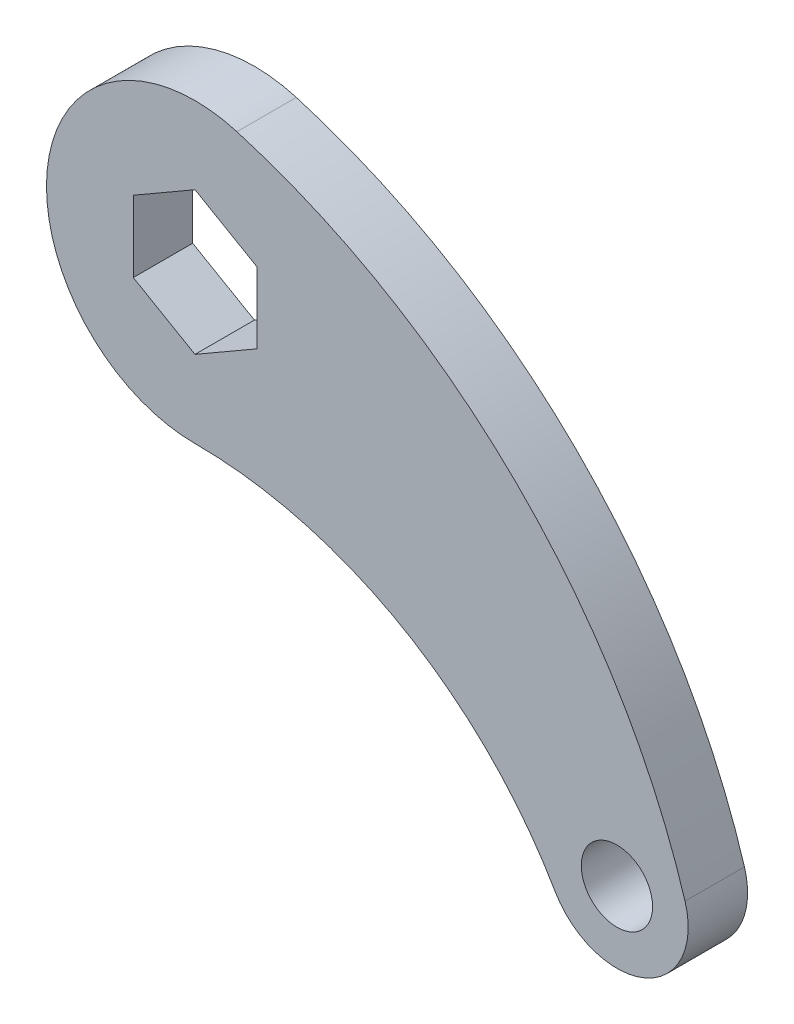
ISO-10303-21;
HEADER;
FILE_DESCRIPTION(('STEP AP214'),'2;1');
FILE_NAME('part.step','',(''),(''),'','','');
FILE_SCHEMA(('AUTOMOTIVE_DESIGN { 1 0 10303 214 1 1 1 1 }'));
ENDSEC;
DATA;
#1=APPLICATION_CONTEXT('core data for automotive mechanical design processes');
#2=APPLICATION_PROTOCOL_DEFINITION('international standard','automotive_design',2000,#1);
#3=PRODUCT_CONTEXT('',#1,'mechanical');
#4=PRODUCT('Part','Part','',(#3));
#5=PRODUCT_RELATED_PRODUCT_CATEGORY('part','',(#4));
#6=PRODUCT_DEFINITION_FORMATION('','',#4);
#7=PRODUCT_DEFINITION_CONTEXT('part definition',#1,'design');
#8=PRODUCT_DEFINITION('design','',#6,#7);
#9=PRODUCT_DEFINITION_SHAPE('','',#8);
#10=(LENGTH_UNIT() NAMED_UNIT(*) SI_UNIT(.MILLI.,.METRE.));
#11=(NAMED_UNIT(*) PLANE_ANGLE_UNIT() SI_UNIT($,.RADIAN.));
#12=(NAMED_UNIT(*) SI_UNIT($,.STERADIAN.) SOLID_ANGLE_UNIT());
#13=UNCERTAINTY_MEASURE_WITH_UNIT(LENGTH_MEASURE(1.E-05),#10,'distance_accuracy_value','');
#14=(GEOMETRIC_REPRESENTATION_CONTEXT(3) GLOBAL_UNCERTAINTY_ASSIGNED_CONTEXT((#13)) GLOBAL_UNIT_ASSIGNED_CONTEXT((#10,
#11,#12)) REPRESENTATION_CONTEXT('',''));
#15=CARTESIAN_POINT('',(0.,0.,0.));
#16=DIRECTION('',(0.,0.,1.));
#17=DIRECTION('',(1.,0.,0.));
#18=AXIS2_PLACEMENT_3D('',#15,#16,#17);
#19=CARTESIAN_POINT('',(0.,95.,10.));
#20=DIRECTION('',(0.,0.,-1.));
#21=DIRECTION('',(-1.,0.,0.));
#22=AXIS2_PLACEMENT_3D('',#19,#20,#21);
#23=CYLINDRICAL_SURFACE('',#22,25.);
#24=CARTESIAN_POINT('',(0.,95.,0.));
#25=DIRECTION('',(0.,0.,1.));
#26=DIRECTION('',(1.,0.,0.));
#27=AXIS2_PLACEMENT_3D('',#24,#25,#26);
#28=CIRCLE('',#27,25.);
#29=CARTESIAN_POINT('',(7.05353648066548,118.984320359683,0.));
#30=VERTEX_POINT('',#29);
#31=CARTESIAN_POINT('',(0.,70.,0.));
#32=VERTEX_POINT('',#31);
#33=EDGE_CURVE('E164',#30,#32,#28,.T.);
#34=ORIENTED_EDGE('',*,*,#33,.T.);
#35=DIRECTION('',(0.,0.,-1.));
#36=VECTOR('',#35,1.);
#37=CARTESIAN_POINT('',(0.,70.,10.));
#38=LINE('',#37,#36);
#39=CARTESIAN_POINT('',(0.,70.,10.));
#40=VERTEX_POINT('',#39);
#41=EDGE_CURVE('E11',#40,#32,#38,.T.);
#42=ORIENTED_EDGE('',*,*,#41,.F.);
#43=CARTESIAN_POINT('',(0.,95.,10.));
#44=DIRECTION('',(0.,0.,1.));
#45=DIRECTION('',(1.,0.,0.));
#46=AXIS2_PLACEMENT_3D('',#43,#44,#45);
#47=CIRCLE('',#46,25.);
#48=CARTESIAN_POINT('',(7.05353648066548,118.984320359683,10.));
#49=VERTEX_POINT('',#48);
#50=EDGE_CURVE('E134',#49,#40,#47,.T.);
#51=ORIENTED_EDGE('',*,*,#50,.F.);
#52=DIRECTION('',(0.,0.,-1.));
#53=VECTOR('',#52,1.);
#54=CARTESIAN_POINT('',(7.05353648066548,118.984320359683,10.));
#55=LINE('',#54,#53);
#56=EDGE_CURVE('E174',#49,#30,#55,.T.);
#57=ORIENTED_EDGE('',*,*,#56,.T.);
#58=EDGE_LOOP('',(#34,#42,#51,#57));
#59=FACE_BOUND('',#58,.T.);
#60=ADVANCED_FACE('F33',(#59),#23,.T.);
#61=CARTESIAN_POINT('',(0.,0.,10.));
#62=DIRECTION('',(0.,0.,-1.));
#63=DIRECTION('',(-1.,0.,0.));
#64=AXIS2_PLACEMENT_3D('',#61,#62,#63);
#65=CYLINDRICAL_SURFACE('',#64,70.);
#66=CARTESIAN_POINT('',(0.,0.,0.));
#67=DIRECTION('',(0.,0.,1.));
#68=DIRECTION('',(1.,0.,0.));
#69=AXIS2_PLACEMENT_3D('',#66,#67,#68);
#70=CIRCLE('',#69,70.);
#71=CARTESIAN_POINT('',(60.6217782649108,34.9999999999999,0.));
#72=VERTEX_POINT('',#71);
#73=EDGE_CURVE('E125',#72,#32,#70,.T.);
#74=ORIENTED_EDGE('',*,*,#73,.F.);
#75=DIRECTION('',(0.,0.,-1.));
#76=VECTOR('',#75,1.);
#77=CARTESIAN_POINT('',(60.6217782649108,34.9999999999999,10.));
#78=LINE('',#77,#76);
#79=CARTESIAN_POINT('',(60.6217782649108,34.9999999999999,10.));
#80=VERTEX_POINT('',#79);
#81=EDGE_CURVE('E43',#80,#72,#78,.T.);
#82=ORIENTED_EDGE('',*,*,#81,.F.);
#83=CARTESIAN_POINT('',(0.,0.,10.));
#84=DIRECTION('',(0.,0.,1.));
#85=DIRECTION('',(1.,0.,0.));
#86=AXIS2_PLACEMENT_3D('',#83,#84,#85);
#87=CIRCLE('',#86,70.);
#88=EDGE_CURVE('E123',#80,#40,#87,.T.);
#89=ORIENTED_EDGE('',*,*,#88,.T.);
#90=ORIENTED_EDGE('',*,*,#41,.T.);
#91=EDGE_LOOP('',(#74,#82,#89,#90));
#92=FACE_BOUND('',#91,.T.);
#93=ADVANCED_FACE('F121',(#92),#65,.F.);
#94=CARTESIAN_POINT('',(71.0140831103241,40.9999999999999,10.));
#95=DIRECTION('',(0.,0.,-1.));
#96=DIRECTION('',(-1.,0.,0.));
#97=AXIS2_PLACEMENT_3D('',#94,#95,#96);
#98=CYLINDRICAL_SURFACE('',#97,12.);
#99=CARTESIAN_POINT('',(71.0140831103241,40.9999999999999,0.));
#100=DIRECTION('',(0.,0.,1.));
#101=DIRECTION('',(1.,0.,0.));
#102=AXIS2_PLACEMENT_3D('',#99,#100,#101);
#103=CIRCLE('',#102,12.);
#104=CARTESIAN_POINT('',(82.4813299178889,44.5358521822036,0.));
#105=VERTEX_POINT('',#104);
#106=EDGE_CURVE('E85',#72,#105,#103,.T.);
#107=ORIENTED_EDGE('',*,*,#106,.T.);
#108=DIRECTION('',(0.,0.,-1.));
#109=VECTOR('',#108,1.);
#110=CARTESIAN_POINT('',(82.4813299178889,44.5358521822036,10.));
#111=LINE('',#110,#109);
#112=CARTESIAN_POINT('',(82.4813299178889,44.5358521822036,10.));
#113=VERTEX_POINT('',#112);
#114=EDGE_CURVE('E126',#113,#105,#111,.T.);
#115=ORIENTED_EDGE('',*,*,#114,.F.);
#116=CARTESIAN_POINT('',(71.0140831103241,40.9999999999999,10.));
#117=DIRECTION('',(0.,0.,1.));
#118=DIRECTION('',(1.,0.,0.));
#119=AXIS2_PLACEMENT_3D('',#116,#117,#118);
#120=CIRCLE('',#119,12.);
#121=EDGE_CURVE('E128',#80,#113,#120,.T.);
#122=ORIENTED_EDGE('',*,*,#121,.F.);
#123=ORIENTED_EDGE('',*,*,#81,.T.);
#124=EDGE_LOOP('',(#107,#115,#122,#123));
#125=FACE_BOUND('',#124,.T.);
#126=ADVANCED_FACE('F129',(#125),#98,.T.);
#127=CARTESIAN_POINT('',(35.9400542570542,62.25,10.));
#128=DIRECTION('',(0.5,0.866025403784439,0.));
#129=DIRECTION('',(-0.866025403784439,0.5,0.));
#130=AXIS2_PLACEMENT_3D('',#127,#128,#129);
#131=PLANE('',#130);
#132=DIRECTION('',(0.866025403784439,-0.5,0.));
#133=VECTOR('',#132,1.);
#134=CARTESIAN_POINT('',(35.9400542570542,62.25,0.));
#135=LINE('',#134,#133);
#136=CARTESIAN_POINT('',(-10.3923048454133,89.,0.));
#137=VERTEX_POINT('',#136);
#138=CARTESIAN_POINT('',(0.,83.,0.));
#139=VERTEX_POINT('',#138);
#140=EDGE_CURVE('E146',#137,#139,#135,.T.);
#141=ORIENTED_EDGE('',*,*,#140,.F.);
#142=DIRECTION('',(0.,0.,-1.));
#143=VECTOR('',#142,1.);
#144=CARTESIAN_POINT('',(-10.3923048454133,89.,10.));
#145=LINE('',#144,#143);
#146=CARTESIAN_POINT('',(-10.3923048454133,89.,10.));
#147=VERTEX_POINT('',#146);
#148=EDGE_CURVE('E37',#147,#137,#145,.T.);
#149=ORIENTED_EDGE('',*,*,#148,.F.);
#150=DIRECTION('',(0.866025403784439,-0.5,0.));
#151=VECTOR('',#150,1.);
#152=CARTESIAN_POINT('',(35.9400542570542,62.25,10.));
#153=LINE('',#152,#151);
#154=CARTESIAN_POINT('',(0.,83.,10.));
#155=VERTEX_POINT('',#154);
#156=EDGE_CURVE('E173',#147,#155,#153,.T.);
#157=ORIENTED_EDGE('',*,*,#156,.T.);
#158=DIRECTION('',(0.,0.,-1.));
#159=VECTOR('',#158,1.);
#160=CARTESIAN_POINT('',(0.,83.,10.));
#161=LINE('',#160,#159);
#162=EDGE_CURVE('E145',#155,#139,#161,.T.);
#163=ORIENTED_EDGE('',*,*,#162,.T.);
#164=EDGE_LOOP('',(#141,#149,#157,#163));
#165=FACE_BOUND('',#164,.T.);
#166=ADVANCED_FACE('F35',(#165),#131,.T.);
#167=CARTESIAN_POINT('',(-10.3923048454133,0.,10.));
#168=DIRECTION('',(1.,0.,0.));
#169=DIRECTION('',(0.,0.,-1.));
#170=AXIS2_PLACEMENT_3D('',#167,#168,#169);
#171=PLANE('',#170);
#172=DIRECTION('',(0.,-1.,0.));
#173=VECTOR('',#172,1.);
#174=CARTESIAN_POINT('',(-10.3923048454133,0.,0.));
#175=LINE('',#174,#173);
#176=CARTESIAN_POINT('',(-10.3923048454133,101.,0.));
#177=VERTEX_POINT('',#176);
#178=EDGE_CURVE('E149',#177,#137,#175,.T.);
#179=ORIENTED_EDGE('',*,*,#178,.F.);
#180=DIRECTION('',(0.,0.,-1.));
#181=VECTOR('',#180,1.);
#182=CARTESIAN_POINT('',(-10.3923048454133,101.,10.));
#183=LINE('',#182,#181);
#184=CARTESIAN_POINT('',(-10.3923048454133,101.,10.));
#185=VERTEX_POINT('',#184);
#186=EDGE_CURVE('E183',#185,#177,#183,.T.);
#187=ORIENTED_EDGE('',*,*,#186,.F.);
#188=DIRECTION('',(0.,-1.,0.));
#189=VECTOR('',#188,1.);
#190=CARTESIAN_POINT('',(-10.3923048454133,0.,10.));
#191=LINE('',#190,#189);
#192=EDGE_CURVE('E192',#185,#147,#191,.T.);
#193=ORIENTED_EDGE('',*,*,#192,.T.);
#194=ORIENTED_EDGE('',*,*,#148,.T.);
#195=EDGE_LOOP('',(#179,#187,#193,#194));
#196=FACE_BOUND('',#195,.T.);
#197=ADVANCED_FACE('F190',(#196),#171,.T.);
#198=CARTESIAN_POINT('',(-46.3323591024675,80.2500000000001,10.));
#199=DIRECTION('',(0.5,-0.866025403784439,0.));
#200=DIRECTION('',(0.866025403784439,0.5,0.));
#201=AXIS2_PLACEMENT_3D('',#198,#199,#200);
#202=PLANE('',#201);
#203=DIRECTION('',(-0.866025403784439,-0.5,0.));
#204=VECTOR('',#203,1.);
#205=CARTESIAN_POINT('',(-46.3323591024675,80.2500000000001,0.));
#206=LINE('',#205,#204);
#207=CARTESIAN_POINT('',(0.,107.,0.));
#208=VERTEX_POINT('',#207);
#209=EDGE_CURVE('E152',#208,#177,#206,.T.);
#210=ORIENTED_EDGE('',*,*,#209,.F.);
#211=DIRECTION('',(0.,0.,-1.));
#212=VECTOR('',#211,1.);
#213=CARTESIAN_POINT('',(0.,107.,10.));
#214=LINE('',#213,#212);
#215=CARTESIAN_POINT('',(0.,107.,10.));
#216=VERTEX_POINT('',#215);
#217=EDGE_CURVE('E182',#216,#208,#214,.T.);
#218=ORIENTED_EDGE('',*,*,#217,.F.);
#219=DIRECTION('',(-0.866025403784439,-0.5,0.));
#220=VECTOR('',#219,1.);
#221=CARTESIAN_POINT('',(-46.3323591024675,80.2500000000001,10.));
#222=LINE('',#221,#220);
#223=EDGE_CURVE('E200',#216,#185,#222,.T.);
#224=ORIENTED_EDGE('',*,*,#223,.T.);
#225=ORIENTED_EDGE('',*,*,#186,.T.);
#226=EDGE_LOOP('',(#210,#218,#224,#225));
#227=FACE_BOUND('',#226,.T.);
#228=ADVANCED_FACE('F198',(#227),#202,.T.);
#229=CARTESIAN_POINT('',(46.3323591024675,80.25,10.));
#230=DIRECTION('',(-0.5,-0.866025403784439,0.));
#231=DIRECTION('',(0.866025403784439,-0.5,0.));
#232=AXIS2_PLACEMENT_3D('',#229,#230,#231);
#233=PLANE('',#232);
#234=DIRECTION('',(-0.866025403784439,0.5,0.));
#235=VECTOR('',#234,1.);
#236=CARTESIAN_POINT('',(46.3323591024675,80.25,0.));
#237=LINE('',#236,#235);
#238=CARTESIAN_POINT('',(10.3923048454133,101.,0.));
#239=VERTEX_POINT('',#238);
#240=EDGE_CURVE('E155',#239,#208,#237,.T.);
#241=ORIENTED_EDGE('',*,*,#240,.F.);
#242=DIRECTION('',(0.,0.,-1.));
#243=VECTOR('',#242,1.);
#244=CARTESIAN_POINT('',(10.3923048454133,101.,10.));
#245=LINE('',#244,#243);
#246=CARTESIAN_POINT('',(10.3923048454133,101.,10.));
#247=VERTEX_POINT('',#246);
#248=EDGE_CURVE('E180',#247,#239,#245,.T.);
#249=ORIENTED_EDGE('',*,*,#248,.F.);
#250=DIRECTION('',(-0.866025403784439,0.5,0.));
#251=VECTOR('',#250,1.);
#252=CARTESIAN_POINT('',(46.3323591024675,80.25,10.));
#253=LINE('',#252,#251);
#254=EDGE_CURVE('E206',#247,#216,#253,.T.);
#255=ORIENTED_EDGE('',*,*,#254,.T.);
#256=ORIENTED_EDGE('',*,*,#217,.T.);
#257=EDGE_LOOP('',(#241,#249,#255,#256));
#258=FACE_BOUND('',#257,.T.);
#259=ADVANCED_FACE('F209',(#258),#233,.T.);
#260=CARTESIAN_POINT('',(10.3923048454133,0.,10.));
#261=DIRECTION('',(-1.,0.,0.));
#262=DIRECTION('',(0.,-1.,0.));
#263=AXIS2_PLACEMENT_3D('',#260,#261,#262);
#264=PLANE('',#263);
#265=DIRECTION('',(0.,1.,0.));
#266=VECTOR('',#265,1.);
#267=CARTESIAN_POINT('',(10.3923048454133,0.,0.));
#268=LINE('',#267,#266);
#269=CARTESIAN_POINT('',(10.3923048454133,89.,0.));
#270=VERTEX_POINT('',#269);
#271=EDGE_CURVE('E158',#270,#239,#268,.T.);
#272=ORIENTED_EDGE('',*,*,#271,.F.);
#273=DIRECTION('',(0.,0.,-1.));
#274=VECTOR('',#273,1.);
#275=CARTESIAN_POINT('',(10.3923048454133,89.,10.));
#276=LINE('',#275,#274);
#277=CARTESIAN_POINT('',(10.3923048454133,89.,10.));
#278=VERTEX_POINT('',#277);
#279=EDGE_CURVE('E178',#278,#270,#276,.T.);
#280=ORIENTED_EDGE('',*,*,#279,.F.);
#281=DIRECTION('',(0.,1.,0.));
#282=VECTOR('',#281,1.);
#283=CARTESIAN_POINT('',(10.3923048454133,0.,10.));
#284=LINE('',#283,#282);
#285=EDGE_CURVE('E210',#278,#247,#284,.T.);
#286=ORIENTED_EDGE('',*,*,#285,.T.);
#287=ORIENTED_EDGE('',*,*,#248,.T.);
#288=EDGE_LOOP('',(#272,#280,#286,#287));
#289=FACE_BOUND('',#288,.T.);
#290=ADVANCED_FACE('F220',(#289),#264,.T.);
#291=CARTESIAN_POINT('',(-24.5463069527159,11.5345651483019,10.));
#292=DIRECTION('',(0.,0.,-1.));
#293=DIRECTION('',(-1.,0.,0.));
#294=AXIS2_PLACEMENT_3D('',#291,#292,#293);
#295=CYLINDRICAL_SURFACE('',#294,112.);
#296=CARTESIAN_POINT('',(-24.5463069527159,11.5345651483019,0.));
#297=DIRECTION('',(0.,0.,1.));
#298=DIRECTION('',(1.,0.,0.));
#299=AXIS2_PLACEMENT_3D('',#296,#297,#298);
#300=CIRCLE('',#299,112.);
#301=EDGE_CURVE('E91',#105,#30,#300,.T.);
#302=ORIENTED_EDGE('',*,*,#301,.T.);
#303=ORIENTED_EDGE('',*,*,#56,.F.);
#304=CARTESIAN_POINT('',(-24.5463069527159,11.5345651483019,10.));
#305=DIRECTION('',(0.,0.,1.));
#306=DIRECTION('',(1.,0.,0.));
#307=AXIS2_PLACEMENT_3D('',#304,#305,#306);
#308=CIRCLE('',#307,112.);
#309=EDGE_CURVE('E52',#113,#49,#308,.T.);
#310=ORIENTED_EDGE('',*,*,#309,.F.);
#311=ORIENTED_EDGE('',*,*,#114,.T.);
#312=EDGE_LOOP('',(#302,#303,#310,#311));
#313=FACE_BOUND('',#312,.T.);
#314=ADVANCED_FACE('F222',(#313),#295,.T.);
#315=CARTESIAN_POINT('',(-35.9400542570542,62.25,10.));
#316=DIRECTION('',(-0.5,0.866025403784439,0.));
#317=DIRECTION('',(-0.866025403784439,-0.5,0.));
#318=AXIS2_PLACEMENT_3D('',#315,#316,#317);
#319=PLANE('',#318);
#320=DIRECTION('',(0.866025403784439,0.5,0.));
#321=VECTOR('',#320,1.);
#322=CARTESIAN_POINT('',(-35.9400542570542,62.25,0.));
#323=LINE('',#322,#321);
#324=EDGE_CURVE('E161',#139,#270,#323,.T.);
#325=ORIENTED_EDGE('',*,*,#324,.F.);
#326=ORIENTED_EDGE('',*,*,#162,.F.);
#327=DIRECTION('',(0.866025403784439,0.5,0.));
#328=VECTOR('',#327,1.);
#329=CARTESIAN_POINT('',(-35.9400542570542,62.25,10.));
#330=LINE('',#329,#328);
#331=EDGE_CURVE('E137',#155,#278,#330,.T.);
#332=ORIENTED_EDGE('',*,*,#331,.T.);
#333=ORIENTED_EDGE('',*,*,#279,.T.);
#334=EDGE_LOOP('',(#325,#326,#332,#333));
#335=FACE_BOUND('',#334,.T.);
#336=ADVANCED_FACE('F217',(#335),#319,.T.);
#337=CARTESIAN_POINT('',(71.0140831103241,40.9999999999999,10.));
#338=DIRECTION('',(0.,0.,-1.));
#339=DIRECTION('',(-1.,0.,0.));
#340=AXIS2_PLACEMENT_3D('',#337,#338,#339);
#341=CYLINDRICAL_SURFACE('',#340,5.99999999999997);
#342=CARTESIAN_POINT('',(71.0140831103241,40.9999999999999,10.));
#343=DIRECTION('',(0.,0.,1.));
#344=DIRECTION('',(1.,0.,0.));
#345=AXIS2_PLACEMENT_3D('',#342,#343,#344);
#346=CIRCLE('',#345,5.99999999999997);
#347=CARTESIAN_POINT('',(77.0140831103241,40.9999999999999,10.));
#348=VERTEX_POINT('',#347);
#349=EDGE_CURVE('E142',#348,#348,#346,.T.);
#350=ORIENTED_EDGE('',*,*,#349,.T.);
#351=EDGE_LOOP('',(#350));
#352=FACE_BOUND('',#351,.T.);
#353=CARTESIAN_POINT('',(71.0140831103241,40.9999999999999,0.));
#354=DIRECTION('',(0.,0.,1.));
#355=DIRECTION('',(1.,0.,0.));
#356=AXIS2_PLACEMENT_3D('',#353,#354,#355);
#357=CIRCLE('',#356,5.99999999999997);
#358=CARTESIAN_POINT('',(77.0140831103241,40.9999999999999,0.));
#359=VERTEX_POINT('',#358);
#360=EDGE_CURVE('E170',#359,#359,#357,.T.);
#361=ORIENTED_EDGE('',*,*,#360,.F.);
#362=EDGE_LOOP('',(#361));
#363=FACE_BOUND('',#362,.T.);
#364=ADVANCED_FACE('F240',(#352,#363),#341,.F.);
#365=CARTESIAN_POINT('',(0.,0.,10.));
#366=DIRECTION('',(0.,0.,1.));
#367=DIRECTION('',(1.,0.,0.));
#368=AXIS2_PLACEMENT_3D('',#365,#366,#367);
#369=PLANE('',#368);
#370=ORIENTED_EDGE('',*,*,#156,.F.);
#371=ORIENTED_EDGE('',*,*,#192,.F.);
#372=ORIENTED_EDGE('',*,*,#223,.F.);
#373=ORIENTED_EDGE('',*,*,#254,.F.);
#374=ORIENTED_EDGE('',*,*,#285,.F.);
#375=ORIENTED_EDGE('',*,*,#331,.F.);
#376=EDGE_LOOP('',(#370,#371,#372,#373,#374,#375));
#377=FACE_BOUND('',#376,.T.);
#378=ORIENTED_EDGE('',*,*,#50,.T.);
#379=ORIENTED_EDGE('',*,*,#88,.F.);
#380=ORIENTED_EDGE('',*,*,#121,.T.);
#381=ORIENTED_EDGE('',*,*,#309,.T.);
#382=EDGE_LOOP('',(#378,#379,#380,#381));
#383=FACE_BOUND('',#382,.T.);
#384=ORIENTED_EDGE('',*,*,#349,.F.);
#385=EDGE_LOOP('',(#384));
#386=FACE_BOUND('',#385,.T.);
#387=ADVANCED_FACE('F131',(#377,#383,#386),#369,.T.);
#388=CARTESIAN_POINT('',(0.,0.,0.));
#389=DIRECTION('',(0.,0.,1.));
#390=DIRECTION('',(1.,0.,0.));
#391=AXIS2_PLACEMENT_3D('',#388,#389,#390);
#392=PLANE('',#391);
#393=ORIENTED_EDGE('',*,*,#140,.T.);
#394=ORIENTED_EDGE('',*,*,#324,.T.);
#395=ORIENTED_EDGE('',*,*,#271,.T.);
#396=ORIENTED_EDGE('',*,*,#240,.T.);
#397=ORIENTED_EDGE('',*,*,#209,.T.);
#398=ORIENTED_EDGE('',*,*,#178,.T.);
#399=EDGE_LOOP('',(#393,#394,#395,#396,#397,#398));
#400=FACE_BOUND('',#399,.T.);
#401=ORIENTED_EDGE('',*,*,#33,.F.);
#402=ORIENTED_EDGE('',*,*,#301,.F.);
#403=ORIENTED_EDGE('',*,*,#106,.F.);
#404=ORIENTED_EDGE('',*,*,#73,.T.);
#405=EDGE_LOOP('',(#401,#402,#403,#404));
#406=FACE_BOUND('',#405,.T.);
#407=ORIENTED_EDGE('',*,*,#360,.T.);
#408=EDGE_LOOP('',(#407));
#409=FACE_BOUND('',#408,.T.);
#410=ADVANCED_FACE('F195',(#400,#406,#409),#392,.F.);
#411=CLOSED_SHELL('',(#60,#93,#126,#166,#197,#228,#259,#290,#314,#336,#364,#387,#410));
#412=MANIFOLD_SOLID_BREP('B2',#411);
#413=ADVANCED_BREP_SHAPE_REPRESENTATION('',(#18,#412),#14);
#414=SHAPE_DEFINITION_REPRESENTATION(#9,#413);
ENDSEC;
END-ISO-10303-21;
